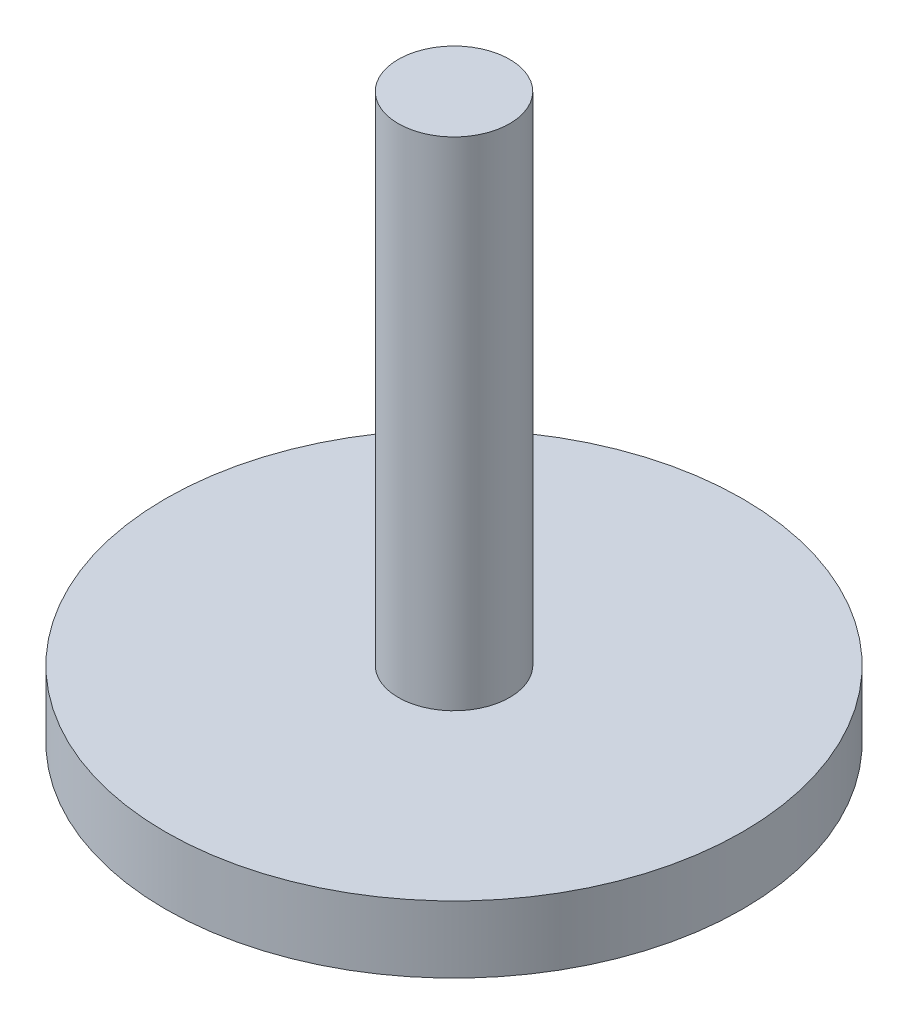
ISO-10303-21;
HEADER;
FILE_DESCRIPTION(('STEP AP214'),'2;1');
FILE_NAME('part.step','',(''),(''),'','','');
FILE_SCHEMA(('AUTOMOTIVE_DESIGN { 1 0 10303 214 1 1 1 1 }'));
ENDSEC;
DATA;
#1=APPLICATION_CONTEXT('core data for automotive mechanical design processes');
#2=APPLICATION_PROTOCOL_DEFINITION('international standard','automotive_design',2000,#1);
#3=PRODUCT_CONTEXT('',#1,'mechanical');
#4=PRODUCT('Part','Part','',(#3));
#5=PRODUCT_RELATED_PRODUCT_CATEGORY('part','',(#4));
#6=PRODUCT_DEFINITION_FORMATION('','',#4);
#7=PRODUCT_DEFINITION_CONTEXT('part definition',#1,'design');
#8=PRODUCT_DEFINITION('design','',#6,#7);
#9=PRODUCT_DEFINITION_SHAPE('','',#8);
#10=(LENGTH_UNIT() NAMED_UNIT(*) SI_UNIT(.MILLI.,.METRE.));
#11=(NAMED_UNIT(*) PLANE_ANGLE_UNIT() SI_UNIT($,.RADIAN.));
#12=(NAMED_UNIT(*) SI_UNIT($,.STERADIAN.) SOLID_ANGLE_UNIT());
#13=UNCERTAINTY_MEASURE_WITH_UNIT(LENGTH_MEASURE(1.E-05),#10,'distance_accuracy_value','');
#14=(GEOMETRIC_REPRESENTATION_CONTEXT(3) GLOBAL_UNCERTAINTY_ASSIGNED_CONTEXT((#13)) GLOBAL_UNIT_ASSIGNED_CONTEXT((#10,
#11,#12)) REPRESENTATION_CONTEXT('',''));
#15=CARTESIAN_POINT('',(0.,0.,0.));
#16=DIRECTION('',(0.,0.,1.));
#17=DIRECTION('',(1.,0.,0.));
#18=AXIS2_PLACEMENT_3D('',#15,#16,#17);
#19=CARTESIAN_POINT('',(0.,3.,0.));
#20=DIRECTION('',(0.,-1.,0.));
#21=DIRECTION('',(0.,0.,-1.));
#22=AXIS2_PLACEMENT_3D('',#19,#20,#21);
#23=CYLINDRICAL_SURFACE('',#22,2.5);
#24=CARTESIAN_POINT('',(0.,3.,0.));
#25=DIRECTION('',(0.,1.,0.));
#26=DIRECTION('',(0.,0.,1.));
#27=AXIS2_PLACEMENT_3D('',#24,#25,#26);
#28=CIRCLE('',#27,2.5);
#29=CARTESIAN_POINT('',(0.,3.,2.5));
#30=VERTEX_POINT('',#29);
#31=EDGE_CURVE('E10',#30,#30,#28,.T.);
#32=ORIENTED_EDGE('',*,*,#31,.F.);
#33=EDGE_LOOP('',(#32));
#34=FACE_BOUND('',#33,.T.);
#35=CARTESIAN_POINT('',(0.,0.,0.));
#36=DIRECTION('',(0.,1.,0.));
#37=DIRECTION('',(0.,0.,1.));
#38=AXIS2_PLACEMENT_3D('',#35,#36,#37);
#39=CIRCLE('',#38,2.5);
#40=CARTESIAN_POINT('',(0.,0.,2.5));
#41=VERTEX_POINT('',#40);
#42=EDGE_CURVE('E33',#41,#41,#39,.T.);
#43=ORIENTED_EDGE('',*,*,#42,.T.);
#44=EDGE_LOOP('',(#43));
#45=FACE_BOUND('',#44,.T.);
#46=ADVANCED_FACE('F30',(#34,#45),#23,.T.);
#47=CARTESIAN_POINT('',(0.,0.,0.));
#48=DIRECTION('',(0.,1.,0.));
#49=DIRECTION('',(0.,0.,1.));
#50=AXIS2_PLACEMENT_3D('',#47,#48,#49);
#51=PLANE('',#50);
#52=ORIENTED_EDGE('',*,*,#42,.F.);
#53=EDGE_LOOP('',(#52));
#54=FACE_BOUND('',#53,.T.);
#55=ADVANCED_FACE('F72',(#54),#51,.F.);
#56=CARTESIAN_POINT('',(0.,6.,0.));
#57=DIRECTION('',(0.,-1.,0.));
#58=DIRECTION('',(0.,0.,-1.));
#59=AXIS2_PLACEMENT_3D('',#56,#57,#58);
#60=CYLINDRICAL_SURFACE('',#59,12.95);
#61=CARTESIAN_POINT('',(0.,6.,0.));
#62=DIRECTION('',(0.,1.,0.));
#63=DIRECTION('',(0.,0.,1.));
#64=AXIS2_PLACEMENT_3D('',#61,#62,#63);
#65=CIRCLE('',#64,12.95);
#66=CARTESIAN_POINT('',(0.,6.,12.95));
#67=VERTEX_POINT('',#66);
#68=EDGE_CURVE('E40',#67,#67,#65,.T.);
#69=ORIENTED_EDGE('',*,*,#68,.F.);
#70=EDGE_LOOP('',(#69));
#71=FACE_BOUND('',#70,.T.);
#72=CARTESIAN_POINT('',(0.,3.,0.));
#73=DIRECTION('',(0.,1.,0.));
#74=DIRECTION('',(0.,0.,1.));
#75=AXIS2_PLACEMENT_3D('',#72,#73,#74);
#76=CIRCLE('',#75,12.95);
#77=CARTESIAN_POINT('',(0.,3.,12.95));
#78=VERTEX_POINT('',#77);
#79=EDGE_CURVE('E42',#78,#78,#76,.T.);
#80=ORIENTED_EDGE('',*,*,#79,.T.);
#81=EDGE_LOOP('',(#80));
#82=FACE_BOUND('',#81,.T.);
#83=ADVANCED_FACE('F66',(#71,#82),#60,.T.);
#84=CARTESIAN_POINT('',(0.,6.,0.));
#85=DIRECTION('',(0.,1.,0.));
#86=DIRECTION('',(0.,0.,1.));
#87=AXIS2_PLACEMENT_3D('',#84,#85,#86);
#88=PLANE('',#87);
#89=CARTESIAN_POINT('',(0.,6.,0.));
#90=DIRECTION('',(0.,1.,0.));
#91=DIRECTION('',(0.,0.,1.));
#92=AXIS2_PLACEMENT_3D('',#89,#90,#91);
#93=CIRCLE('',#92,2.5);
#94=CARTESIAN_POINT('',(0.,6.,2.5));
#95=VERTEX_POINT('',#94);
#96=EDGE_CURVE('E48',#95,#95,#93,.T.);
#97=ORIENTED_EDGE('',*,*,#96,.F.);
#98=EDGE_LOOP('',(#97));
#99=FACE_BOUND('',#98,.T.);
#100=ORIENTED_EDGE('',*,*,#68,.T.);
#101=EDGE_LOOP('',(#100));
#102=FACE_BOUND('',#101,.T.);
#103=ADVANCED_FACE('F63',(#99,#102),#88,.T.);
#104=CARTESIAN_POINT('',(0.,3.,0.));
#105=DIRECTION('',(0.,1.,0.));
#106=DIRECTION('',(0.,0.,1.));
#107=AXIS2_PLACEMENT_3D('',#104,#105,#106);
#108=PLANE('',#107);
#109=ORIENTED_EDGE('',*,*,#31,.T.);
#110=EDGE_LOOP('',(#109));
#111=FACE_BOUND('',#110,.T.);
#112=ORIENTED_EDGE('',*,*,#79,.F.);
#113=EDGE_LOOP('',(#112));
#114=FACE_BOUND('',#113,.T.);
#115=ADVANCED_FACE('F59',(#111,#114),#108,.F.);
#116=CARTESIAN_POINT('',(0.,28.3,0.));
#117=DIRECTION('',(0.,-1.,0.));
#118=DIRECTION('',(0.,0.,-1.));
#119=AXIS2_PLACEMENT_3D('',#116,#117,#118);
#120=CYLINDRICAL_SURFACE('',#119,2.5);
#121=CARTESIAN_POINT('',(0.,28.3,0.));
#122=DIRECTION('',(0.,1.,0.));
#123=DIRECTION('',(0.,0.,1.));
#124=AXIS2_PLACEMENT_3D('',#121,#122,#123);
#125=CIRCLE('',#124,2.5);
#126=CARTESIAN_POINT('',(0.,28.3,2.5));
#127=VERTEX_POINT('',#126);
#128=EDGE_CURVE('E45',#127,#127,#125,.T.);
#129=ORIENTED_EDGE('',*,*,#128,.F.);
#130=EDGE_LOOP('',(#129));
#131=FACE_BOUND('',#130,.T.);
#132=ORIENTED_EDGE('',*,*,#96,.T.);
#133=EDGE_LOOP('',(#132));
#134=FACE_BOUND('',#133,.T.);
#135=ADVANCED_FACE('F56',(#131,#134),#120,.T.);
#136=CARTESIAN_POINT('',(0.,28.3,0.));
#137=DIRECTION('',(0.,1.,0.));
#138=DIRECTION('',(0.,0.,1.));
#139=AXIS2_PLACEMENT_3D('',#136,#137,#138);
#140=PLANE('',#139);
#141=ORIENTED_EDGE('',*,*,#128,.T.);
#142=EDGE_LOOP('',(#141));
#143=FACE_BOUND('',#142,.T.);
#144=ADVANCED_FACE('F54',(#143),#140,.T.);
#145=CLOSED_SHELL('',(#46,#55,#83,#103,#115,#135,#144));
#146=MANIFOLD_SOLID_BREP('B2',#145);
#147=ADVANCED_BREP_SHAPE_REPRESENTATION('',(#18,#146),#14);
#148=SHAPE_DEFINITION_REPRESENTATION(#9,#147);
ENDSEC;
END-ISO-10303-21;
